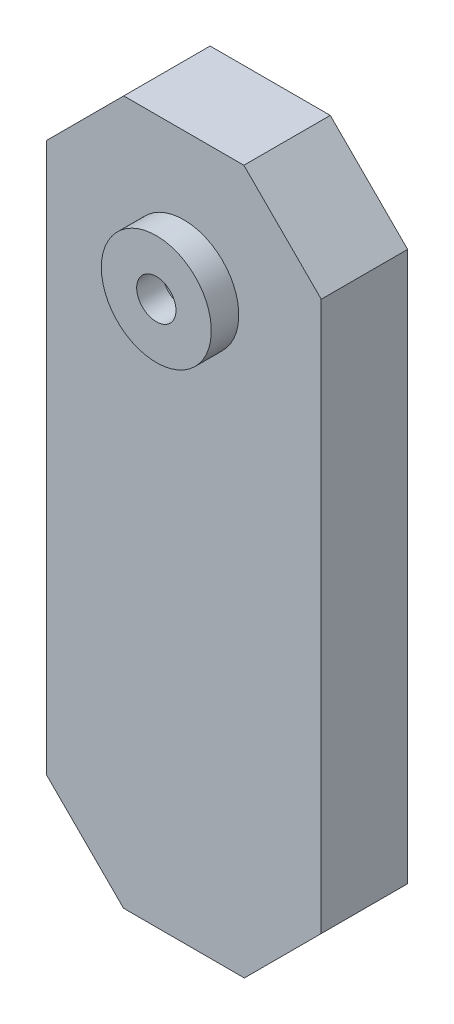
ISO-10303-21;
HEADER;
FILE_DESCRIPTION(('STEP AP214'),'2;1');
FILE_NAME('part.step','',(''),(''),'','','');
FILE_SCHEMA(('AUTOMOTIVE_DESIGN { 1 0 10303 214 1 1 1 1 }'));
ENDSEC;
DATA;
#1=APPLICATION_CONTEXT('core data for automotive mechanical design processes');
#2=APPLICATION_PROTOCOL_DEFINITION('international standard','automotive_design',2000,#1);
#3=PRODUCT_CONTEXT('',#1,'mechanical');
#4=PRODUCT('Part','Part','',(#3));
#5=PRODUCT_RELATED_PRODUCT_CATEGORY('part','',(#4));
#6=PRODUCT_DEFINITION_FORMATION('','',#4);
#7=PRODUCT_DEFINITION_CONTEXT('part definition',#1,'design');
#8=PRODUCT_DEFINITION('design','',#6,#7);
#9=PRODUCT_DEFINITION_SHAPE('','',#8);
#10=(LENGTH_UNIT() NAMED_UNIT(*) SI_UNIT(.MILLI.,.METRE.));
#11=(NAMED_UNIT(*) PLANE_ANGLE_UNIT() SI_UNIT($,.RADIAN.));
#12=(NAMED_UNIT(*) SI_UNIT($,.STERADIAN.) SOLID_ANGLE_UNIT());
#13=UNCERTAINTY_MEASURE_WITH_UNIT(LENGTH_MEASURE(1.E-05),#10,'distance_accuracy_value','');
#14=(GEOMETRIC_REPRESENTATION_CONTEXT(3) GLOBAL_UNCERTAINTY_ASSIGNED_CONTEXT((#13)) GLOBAL_UNIT_ASSIGNED_CONTEXT((#10,
#11,#12)) REPRESENTATION_CONTEXT('',''));
#15=CARTESIAN_POINT('',(0.,0.,0.));
#16=DIRECTION('',(0.,0.,1.));
#17=DIRECTION('',(1.,0.,0.));
#18=AXIS2_PLACEMENT_3D('',#15,#16,#17);
#19=CARTESIAN_POINT('',(-108.417078441272,540.825947063664,0.));
#20=DIRECTION('',(0.,-1.,0.));
#21=DIRECTION('',(1.,0.,0.));
#22=AXIS2_PLACEMENT_3D('',#19,#20,#21);
#23=CYLINDRICAL_SURFACE('',#22,3.50000000000001);
#24=CARTESIAN_POINT('',(-108.417078441272,540.825947063664,0.));
#25=DIRECTION('',(0.,1.,0.));
#26=DIRECTION('',(-1.,0.,0.));
#27=AXIS2_PLACEMENT_3D('',#24,#25,#26);
#28=CIRCLE('',#27,3.50000000000001);
#29=CARTESIAN_POINT('',(-111.917078441272,540.825947063664,0.));
#30=VERTEX_POINT('',#29);
#31=EDGE_CURVE('E11',#30,#30,#28,.T.);
#32=ORIENTED_EDGE('',*,*,#31,.F.);
#33=EDGE_LOOP('',(#32));
#34=FACE_BOUND('',#33,.T.);
#35=CARTESIAN_POINT('',(-108.417078441272,490.825947063664,0.));
#36=DIRECTION('',(0.,1.,0.));
#37=DIRECTION('',(-1.,0.,0.));
#38=AXIS2_PLACEMENT_3D('',#35,#36,#37);
#39=CIRCLE('',#38,3.50000000000001);
#40=CARTESIAN_POINT('',(-111.917078441272,490.825947063664,0.));
#41=VERTEX_POINT('',#40);
#42=EDGE_CURVE('E43',#41,#41,#39,.T.);
#43=ORIENTED_EDGE('',*,*,#42,.T.);
#44=EDGE_LOOP('',(#43));
#45=FACE_BOUND('',#44,.T.);
#46=ADVANCED_FACE('F40',(#34,#45),#23,.T.);
#47=CARTESIAN_POINT('',(-108.417078441272,540.825947063664,0.));
#48=DIRECTION('',(0.,1.,0.));
#49=DIRECTION('',(-1.,0.,0.));
#50=AXIS2_PLACEMENT_3D('',#47,#48,#49);
#51=PLANE('',#50);
#52=ORIENTED_EDGE('',*,*,#31,.T.);
#53=EDGE_LOOP('',(#52));
#54=FACE_BOUND('',#53,.T.);
#55=ADVANCED_FACE('F55',(#54),#51,.T.);
#56=CARTESIAN_POINT('',(-108.417078441272,490.825947063664,0.));
#57=DIRECTION('',(0.,1.,0.));
#58=DIRECTION('',(-1.,0.,0.));
#59=AXIS2_PLACEMENT_3D('',#56,#57,#58);
#60=PLANE('',#59);
#61=ORIENTED_EDGE('',*,*,#42,.F.);
#62=EDGE_LOOP('',(#61));
#63=FACE_BOUND('',#62,.T.);
#64=ADVANCED_FACE('F53',(#63),#60,.F.);
#65=CLOSED_SHELL('',(#46,#55,#64));
#66=MANIFOLD_SOLID_BREP('B2',#65);
#67=CARTESIAN_POINT('',(105.082921558728,640.825947063665,66.));
#68=DIRECTION('',(0.,0.,1.));
#69=DIRECTION('',(1.,0.,0.));
#70=AXIS2_PLACEMENT_3D('',#67,#68,#69);
#71=PLANE('',#70);
#72=DIRECTION('',(0.,1.,0.));
#73=VECTOR('',#72,1.);
#74=CARTESIAN_POINT('',(105.082921558728,162.025080800368,66.));
#75=LINE('',#74,#73);
#76=CARTESIAN_POINT('',(105.082921558728,162.025080800368,66.));
#77=VERTEX_POINT('',#76);
#78=CARTESIAN_POINT('',(105.082921558728,581.722068253563,66.));
#79=VERTEX_POINT('',#78);
#80=EDGE_CURVE('E193',#77,#79,#75,.T.);
#81=ORIENTED_EDGE('',*,*,#80,.T.);
#82=DIRECTION('',(-0.707106781186547,0.707106781186548,0.));
#83=VECTOR('',#82,1.);
#84=CARTESIAN_POINT('',(105.082921558728,581.722068253563,66.));
#85=LINE('',#84,#83);
#86=CARTESIAN_POINT('',(45.9790427486258,640.825947063665,66.));
#87=VERTEX_POINT('',#86);
#88=EDGE_CURVE('E141',#79,#87,#85,.T.);
#89=ORIENTED_EDGE('',*,*,#88,.T.);
#90=DIRECTION('',(-1.,0.,0.));
#91=VECTOR('',#90,1.);
#92=CARTESIAN_POINT('',(45.9790427486258,640.825947063665,66.));
#93=LINE('',#92,#91);
#94=CARTESIAN_POINT('',(-45.8131996311706,640.825947063664,66.));
#95=VERTEX_POINT('',#94);
#96=EDGE_CURVE('E208',#87,#95,#93,.T.);
#97=ORIENTED_EDGE('',*,*,#96,.T.);
#98=DIRECTION('',(-0.707106781186547,-0.707106781186548,0.));
#99=VECTOR('',#98,1.);
#100=CARTESIAN_POINT('',(-45.8131996311706,640.825947063664,66.));
#101=LINE('',#100,#99);
#102=CARTESIAN_POINT('',(-104.917078441272,581.722068253563,66.));
#103=VERTEX_POINT('',#102);
#104=EDGE_CURVE('E220',#95,#103,#101,.T.);
#105=ORIENTED_EDGE('',*,*,#104,.T.);
#106=DIRECTION('',(0.,-1.,0.));
#107=VECTOR('',#106,1.);
#108=CARTESIAN_POINT('',(-104.917078441272,581.722068253563,66.));
#109=LINE('',#108,#107);
#110=CARTESIAN_POINT('',(-104.917078441272,162.212880509357,66.));
#111=VERTEX_POINT('',#110);
#112=EDGE_CURVE('E160',#103,#111,#109,.T.);
#113=ORIENTED_EDGE('',*,*,#112,.T.);
#114=DIRECTION('',(0.707106781186547,-0.707106781186547,0.));
#115=VECTOR('',#114,1.);
#116=CARTESIAN_POINT('',(-104.917078441272,162.212880509357,66.));
#117=LINE('',#116,#115);
#118=CARTESIAN_POINT('',(-45.973174510304,103.268976578389,66.));
#119=VERTEX_POINT('',#118);
#120=EDGE_CURVE('E154',#111,#119,#117,.T.);
#121=ORIENTED_EDGE('',*,*,#120,.T.);
#122=DIRECTION('',(1.,0.,0.));
#123=VECTOR('',#122,1.);
#124=CARTESIAN_POINT('',(-45.973174510304,103.268976578389,66.));
#125=LINE('',#124,#123);
#126=CARTESIAN_POINT('',(46.326817336749,103.268976578389,66.));
#127=VERTEX_POINT('',#126);
#128=EDGE_CURVE('E158',#119,#127,#125,.T.);
#129=ORIENTED_EDGE('',*,*,#128,.T.);
#130=DIRECTION('',(0.707106781186547,0.707106781186548,0.));
#131=VECTOR('',#130,1.);
#132=CARTESIAN_POINT('',(46.326817336749,103.268976578389,66.));
#133=LINE('',#132,#131);
#134=EDGE_CURVE('E98',#127,#77,#133,.T.);
#135=ORIENTED_EDGE('',*,*,#134,.T.);
#136=EDGE_LOOP('',(#81,#89,#97,#105,#113,#121,#129,#135));
#137=FACE_BOUND('',#136,.T.);
#138=CARTESIAN_POINT('',(0.0829215587276402,539.825947063665,66.));
#139=DIRECTION('',(0.,0.,1.));
#140=DIRECTION('',(1.,0.,0.));
#141=AXIS2_PLACEMENT_3D('',#138,#139,#140);
#142=CIRCLE('',#141,42.);
#143=CARTESIAN_POINT('',(-41.9170784412724,539.825947063665,66.));
#144=VERTEX_POINT('',#143);
#145=EDGE_CURVE('E226',#144,#144,#142,.T.);
#146=ORIENTED_EDGE('',*,*,#145,.F.);
#147=EDGE_LOOP('',(#146));
#148=FACE_BOUND('',#147,.T.);
#149=ADVANCED_FACE('F81',(#137,#148),#71,.T.);
#150=CARTESIAN_POINT('',(105.082921558728,162.025080800368,66.));
#151=DIRECTION('',(-1.,0.,0.));
#152=DIRECTION('',(0.,-1.,0.));
#153=AXIS2_PLACEMENT_3D('',#150,#151,#152);
#154=PLANE('',#153);
#155=DIRECTION('',(0.,1.,0.));
#156=VECTOR('',#155,1.);
#157=CARTESIAN_POINT('',(105.082921558728,162.025080800368,0.));
#158=LINE('',#157,#156);
#159=CARTESIAN_POINT('',(105.082921558728,162.025080800368,0.));
#160=VERTEX_POINT('',#159);
#161=CARTESIAN_POINT('',(105.082921558728,581.722068253563,0.));
#162=VERTEX_POINT('',#161);
#163=EDGE_CURVE('E178',#160,#162,#158,.T.);
#164=ORIENTED_EDGE('',*,*,#163,.T.);
#165=DIRECTION('',(0.,0.,-1.));
#166=VECTOR('',#165,1.);
#167=CARTESIAN_POINT('',(105.082921558728,581.722068253563,66.));
#168=LINE('',#167,#166);
#169=EDGE_CURVE('E38',#79,#162,#168,.T.);
#170=ORIENTED_EDGE('',*,*,#169,.F.);
#171=ORIENTED_EDGE('',*,*,#80,.F.);
#172=DIRECTION('',(0.,0.,-1.));
#173=VECTOR('',#172,1.);
#174=CARTESIAN_POINT('',(105.082921558728,162.025080800368,66.));
#175=LINE('',#174,#173);
#176=EDGE_CURVE('E174',#77,#160,#175,.T.);
#177=ORIENTED_EDGE('',*,*,#176,.T.);
#178=EDGE_LOOP('',(#164,#170,#171,#177));
#179=FACE_BOUND('',#178,.T.);
#180=ADVANCED_FACE('F83',(#179),#154,.F.);
#181=CARTESIAN_POINT('',(105.082921558728,581.722068253563,66.));
#182=DIRECTION('',(-0.707106781186548,-0.707106781186547,0.));
#183=DIRECTION('',(0.707106781186547,-0.707106781186548,0.));
#184=AXIS2_PLACEMENT_3D('',#181,#182,#183);
#185=PLANE('',#184);
#186=DIRECTION('',(-0.707106781186547,0.707106781186548,0.));
#187=VECTOR('',#186,1.);
#188=CARTESIAN_POINT('',(105.082921558728,581.722068253563,0.));
#189=LINE('',#188,#187);
#190=CARTESIAN_POINT('',(45.9790427486258,640.825947063665,0.));
#191=VERTEX_POINT('',#190);
#192=EDGE_CURVE('E181',#162,#191,#189,.T.);
#193=ORIENTED_EDGE('',*,*,#192,.T.);
#194=DIRECTION('',(0.,0.,-1.));
#195=VECTOR('',#194,1.);
#196=CARTESIAN_POINT('',(45.9790427486258,640.825947063665,66.));
#197=LINE('',#196,#195);
#198=EDGE_CURVE('E90',#87,#191,#197,.T.);
#199=ORIENTED_EDGE('',*,*,#198,.F.);
#200=ORIENTED_EDGE('',*,*,#88,.F.);
#201=ORIENTED_EDGE('',*,*,#169,.T.);
#202=EDGE_LOOP('',(#193,#199,#200,#201));
#203=FACE_BOUND('',#202,.T.);
#204=ADVANCED_FACE('F264',(#203),#185,.F.);
#205=CARTESIAN_POINT('',(45.9790427486258,640.825947063665,66.));
#206=DIRECTION('',(0.,-1.,0.));
#207=DIRECTION('',(1.,0.,0.));
#208=AXIS2_PLACEMENT_3D('',#205,#206,#207);
#209=PLANE('',#208);
#210=DIRECTION('',(-1.,0.,0.));
#211=VECTOR('',#210,1.);
#212=CARTESIAN_POINT('',(45.9790427486258,640.825947063665,0.));
#213=LINE('',#212,#211);
#214=CARTESIAN_POINT('',(-45.8131996311706,640.825947063664,0.));
#215=VERTEX_POINT('',#214);
#216=EDGE_CURVE('E184',#191,#215,#213,.T.);
#217=ORIENTED_EDGE('',*,*,#216,.T.);
#218=DIRECTION('',(0.,0.,-1.));
#219=VECTOR('',#218,1.);
#220=CARTESIAN_POINT('',(-45.8131996311706,640.825947063664,66.));
#221=LINE('',#220,#219);
#222=EDGE_CURVE('E200',#95,#215,#221,.T.);
#223=ORIENTED_EDGE('',*,*,#222,.F.);
#224=ORIENTED_EDGE('',*,*,#96,.F.);
#225=ORIENTED_EDGE('',*,*,#198,.T.);
#226=EDGE_LOOP('',(#217,#223,#224,#225));
#227=FACE_BOUND('',#226,.T.);
#228=ADVANCED_FACE('F206',(#227),#209,.F.);
#229=CARTESIAN_POINT('',(-45.8131996311706,640.825947063664,66.));
#230=DIRECTION('',(0.707106781186548,-0.707106781186547,0.));
#231=DIRECTION('',(0.707106781186547,0.707106781186548,0.));
#232=AXIS2_PLACEMENT_3D('',#229,#230,#231);
#233=PLANE('',#232);
#234=DIRECTION('',(-0.707106781186547,-0.707106781186548,0.));
#235=VECTOR('',#234,1.);
#236=CARTESIAN_POINT('',(-45.8131996311706,640.825947063664,0.));
#237=LINE('',#236,#235);
#238=CARTESIAN_POINT('',(-104.917078441272,581.722068253563,0.));
#239=VERTEX_POINT('',#238);
#240=EDGE_CURVE('E186',#215,#239,#237,.T.);
#241=ORIENTED_EDGE('',*,*,#240,.T.);
#242=DIRECTION('',(0.,0.,-1.));
#243=VECTOR('',#242,1.);
#244=CARTESIAN_POINT('',(-104.917078441272,581.722068253563,66.));
#245=LINE('',#244,#243);
#246=EDGE_CURVE('E197',#103,#239,#245,.T.);
#247=ORIENTED_EDGE('',*,*,#246,.F.);
#248=ORIENTED_EDGE('',*,*,#104,.F.);
#249=ORIENTED_EDGE('',*,*,#222,.T.);
#250=EDGE_LOOP('',(#241,#247,#248,#249));
#251=FACE_BOUND('',#250,.T.);
#252=ADVANCED_FACE('F216',(#251),#233,.F.);
#253=CARTESIAN_POINT('',(-104.917078441272,581.722068253563,66.));
#254=DIRECTION('',(1.,0.,0.));
#255=DIRECTION('',(0.,1.,0.));
#256=AXIS2_PLACEMENT_3D('',#253,#254,#255);
#257=PLANE('',#256);
#258=DIRECTION('',(0.,-1.,0.));
#259=VECTOR('',#258,1.);
#260=CARTESIAN_POINT('',(-104.917078441272,581.722068253563,0.));
#261=LINE('',#260,#259);
#262=CARTESIAN_POINT('',(-104.917078441272,162.212880509357,0.));
#263=VERTEX_POINT('',#262);
#264=EDGE_CURVE('E188',#239,#263,#261,.T.);
#265=ORIENTED_EDGE('',*,*,#264,.T.);
#266=DIRECTION('',(0.,0.,-1.));
#267=VECTOR('',#266,1.);
#268=CARTESIAN_POINT('',(-104.917078441272,162.212880509357,66.));
#269=LINE('',#268,#267);
#270=EDGE_CURVE('E169',#111,#263,#269,.T.);
#271=ORIENTED_EDGE('',*,*,#270,.F.);
#272=ORIENTED_EDGE('',*,*,#112,.F.);
#273=ORIENTED_EDGE('',*,*,#246,.T.);
#274=EDGE_LOOP('',(#265,#271,#272,#273));
#275=FACE_BOUND('',#274,.T.);
#276=ADVANCED_FACE('F219',(#275),#257,.F.);
#277=CARTESIAN_POINT('',(-104.917078441272,162.212880509357,66.));
#278=DIRECTION('',(0.707106781186547,0.707106781186547,0.));
#279=DIRECTION('',(-0.707106781186548,0.707106781186548,0.));
#280=AXIS2_PLACEMENT_3D('',#277,#278,#279);
#281=PLANE('',#280);
#282=DIRECTION('',(0.707106781186547,-0.707106781186547,0.));
#283=VECTOR('',#282,1.);
#284=CARTESIAN_POINT('',(-104.917078441272,162.212880509357,0.));
#285=LINE('',#284,#283);
#286=CARTESIAN_POINT('',(-45.973174510304,103.268976578389,0.));
#287=VERTEX_POINT('',#286);
#288=EDGE_CURVE('E168',#263,#287,#285,.T.);
#289=ORIENTED_EDGE('',*,*,#288,.T.);
#290=DIRECTION('',(0.,0.,-1.));
#291=VECTOR('',#290,1.);
#292=CARTESIAN_POINT('',(-45.973174510304,103.268976578389,66.));
#293=LINE('',#292,#291);
#294=EDGE_CURVE('E165',#119,#287,#293,.T.);
#295=ORIENTED_EDGE('',*,*,#294,.F.);
#296=ORIENTED_EDGE('',*,*,#120,.F.);
#297=ORIENTED_EDGE('',*,*,#270,.T.);
#298=EDGE_LOOP('',(#289,#295,#296,#297));
#299=FACE_BOUND('',#298,.T.);
#300=ADVANCED_FACE('F166',(#299),#281,.F.);
#301=CARTESIAN_POINT('',(-45.973174510304,103.268976578389,66.));
#302=DIRECTION('',(0.,1.,0.));
#303=DIRECTION('',(0.,0.,1.));
#304=AXIS2_PLACEMENT_3D('',#301,#302,#303);
#305=PLANE('',#304);
#306=DIRECTION('',(1.,0.,0.));
#307=VECTOR('',#306,1.);
#308=CARTESIAN_POINT('',(-45.973174510304,103.268976578389,0.));
#309=LINE('',#308,#307);
#310=CARTESIAN_POINT('',(46.326817336749,103.268976578389,0.));
#311=VERTEX_POINT('',#310);
#312=EDGE_CURVE('E127',#287,#311,#309,.T.);
#313=ORIENTED_EDGE('',*,*,#312,.T.);
#314=DIRECTION('',(0.,0.,-1.));
#315=VECTOR('',#314,1.);
#316=CARTESIAN_POINT('',(46.326817336749,103.268976578389,66.));
#317=LINE('',#316,#315);
#318=EDGE_CURVE('E170',#127,#311,#317,.T.);
#319=ORIENTED_EDGE('',*,*,#318,.F.);
#320=ORIENTED_EDGE('',*,*,#128,.F.);
#321=ORIENTED_EDGE('',*,*,#294,.T.);
#322=EDGE_LOOP('',(#313,#319,#320,#321));
#323=FACE_BOUND('',#322,.T.);
#324=ADVANCED_FACE('F172',(#323),#305,.F.);
#325=CARTESIAN_POINT('',(46.326817336749,103.268976578389,66.));
#326=DIRECTION('',(-0.707106781186548,0.707106781186547,0.));
#327=DIRECTION('',(-0.707106781186547,-0.707106781186548,0.));
#328=AXIS2_PLACEMENT_3D('',#325,#326,#327);
#329=PLANE('',#328);
#330=DIRECTION('',(0.707106781186547,0.707106781186548,0.));
#331=VECTOR('',#330,1.);
#332=CARTESIAN_POINT('',(46.326817336749,103.268976578389,0.));
#333=LINE('',#332,#331);
#334=EDGE_CURVE('E133',#311,#160,#333,.T.);
#335=ORIENTED_EDGE('',*,*,#334,.T.);
#336=ORIENTED_EDGE('',*,*,#176,.F.);
#337=ORIENTED_EDGE('',*,*,#134,.F.);
#338=ORIENTED_EDGE('',*,*,#318,.T.);
#339=EDGE_LOOP('',(#335,#336,#337,#338));
#340=FACE_BOUND('',#339,.T.);
#341=ADVANCED_FACE('F269',(#340),#329,.F.);
#342=CARTESIAN_POINT('',(105.082921558728,640.825947063665,0.));
#343=DIRECTION('',(0.,0.,1.));
#344=DIRECTION('',(1.,0.,0.));
#345=AXIS2_PLACEMENT_3D('',#342,#343,#344);
#346=PLANE('',#345);
#347=ORIENTED_EDGE('',*,*,#163,.F.);
#348=ORIENTED_EDGE('',*,*,#334,.F.);
#349=ORIENTED_EDGE('',*,*,#312,.F.);
#350=ORIENTED_EDGE('',*,*,#288,.F.);
#351=ORIENTED_EDGE('',*,*,#264,.F.);
#352=ORIENTED_EDGE('',*,*,#240,.F.);
#353=ORIENTED_EDGE('',*,*,#216,.F.);
#354=ORIENTED_EDGE('',*,*,#192,.F.);
#355=EDGE_LOOP('',(#347,#348,#349,#350,#351,#352,#353,#354));
#356=FACE_BOUND('',#355,.T.);
#357=ADVANCED_FACE('F212',(#356),#346,.F.);
#358=CARTESIAN_POINT('',(0.0829215587276402,539.825947063665,87.));
#359=DIRECTION('',(0.,0.,-1.));
#360=DIRECTION('',(-1.,0.,0.));
#361=AXIS2_PLACEMENT_3D('',#358,#359,#360);
#362=CYLINDRICAL_SURFACE('',#361,42.);
#363=CARTESIAN_POINT('',(0.0829215587276402,539.825947063665,87.));
#364=DIRECTION('',(0.,0.,1.));
#365=DIRECTION('',(1.,0.,0.));
#366=AXIS2_PLACEMENT_3D('',#363,#364,#365);
#367=CIRCLE('',#366,42.);
#368=CARTESIAN_POINT('',(-41.9170784412724,539.825947063665,87.));
#369=VERTEX_POINT('',#368);
#370=EDGE_CURVE('E182',#369,#369,#367,.T.);
#371=CARTESIAN_POINT('',(-41.9170784412724,539.825947063665,87.));
#372=CARTESIAN_POINT('',(-41.9170784412724,539.825947063665,86.78125));
#373=CARTESIAN_POINT('',(-41.9170784412724,539.825947063665,86.5625));
#374=CARTESIAN_POINT('',(-41.9170784412724,539.825947063665,86.125));
#375=CARTESIAN_POINT('',(-41.9170784412724,539.825947063665,85.90625));
#376=CARTESIAN_POINT('',(-41.9170784412724,539.825947063665,85.46875));
#377=CARTESIAN_POINT('',(-41.9170784412724,539.825947063665,85.25));
#378=CARTESIAN_POINT('',(-41.9170784412724,539.825947063665,84.8125));
#379=CARTESIAN_POINT('',(-41.9170784412724,539.825947063665,84.59375));
#380=CARTESIAN_POINT('',(-41.9170784412724,539.825947063665,84.15625));
#381=CARTESIAN_POINT('',(-41.9170784412724,539.825947063665,83.9375));
#382=CARTESIAN_POINT('',(-41.9170784412724,539.825947063665,83.5));
#383=CARTESIAN_POINT('',(-41.9170784412724,539.825947063665,83.28125));
#384=CARTESIAN_POINT('',(-41.9170784412724,539.825947063665,82.84375));
#385=CARTESIAN_POINT('',(-41.9170784412724,539.825947063665,82.625));
#386=CARTESIAN_POINT('',(-41.9170784412724,539.825947063665,82.1875));
#387=CARTESIAN_POINT('',(-41.9170784412724,539.825947063665,81.96875));
#388=CARTESIAN_POINT('',(-41.9170784412724,539.825947063665,81.53125));
#389=CARTESIAN_POINT('',(-41.9170784412724,539.825947063665,81.3125));
#390=CARTESIAN_POINT('',(-41.9170784412724,539.825947063665,80.875));
#391=CARTESIAN_POINT('',(-41.9170784412724,539.825947063665,80.65625));
#392=CARTESIAN_POINT('',(-41.9170784412724,539.825947063665,80.21875));
#393=CARTESIAN_POINT('',(-41.9170784412724,539.825947063665,80.));
#394=CARTESIAN_POINT('',(-41.9170784412724,539.825947063665,79.5625));
#395=CARTESIAN_POINT('',(-41.9170784412724,539.825947063665,79.34375));
#396=CARTESIAN_POINT('',(-41.9170784412724,539.825947063665,78.90625));
#397=CARTESIAN_POINT('',(-41.9170784412724,539.825947063665,78.6875));
#398=CARTESIAN_POINT('',(-41.9170784412724,539.825947063665,78.25));
#399=CARTESIAN_POINT('',(-41.9170784412724,539.825947063665,78.03125));
#400=CARTESIAN_POINT('',(-41.9170784412724,539.825947063665,77.59375));
#401=CARTESIAN_POINT('',(-41.9170784412724,539.825947063665,77.375));
#402=CARTESIAN_POINT('',(-41.9170784412724,539.825947063665,76.9375));
#403=CARTESIAN_POINT('',(-41.9170784412724,539.825947063665,76.71875));
#404=CARTESIAN_POINT('',(-41.9170784412724,539.825947063665,76.28125));
#405=CARTESIAN_POINT('',(-41.9170784412724,539.825947063665,76.0625));
#406=CARTESIAN_POINT('',(-41.9170784412724,539.825947063665,75.625));
#407=CARTESIAN_POINT('',(-41.9170784412724,539.825947063665,75.40625));
#408=CARTESIAN_POINT('',(-41.9170784412724,539.825947063665,74.96875));
#409=CARTESIAN_POINT('',(-41.9170784412724,539.825947063665,74.75));
#410=CARTESIAN_POINT('',(-41.9170784412724,539.825947063665,74.3125));
#411=CARTESIAN_POINT('',(-41.9170784412724,539.825947063665,74.09375));
#412=CARTESIAN_POINT('',(-41.9170784412724,539.825947063665,73.65625));
#413=CARTESIAN_POINT('',(-41.9170784412724,539.825947063665,73.4375));
#414=CARTESIAN_POINT('',(-41.9170784412724,539.825947063665,73.));
#415=CARTESIAN_POINT('',(-41.9170784412724,539.825947063665,72.78125));
#416=CARTESIAN_POINT('',(-41.9170784412724,539.825947063665,72.34375));
#417=CARTESIAN_POINT('',(-41.9170784412724,539.825947063665,72.125));
#418=CARTESIAN_POINT('',(-41.9170784412724,539.825947063665,71.6875));
#419=CARTESIAN_POINT('',(-41.9170784412724,539.825947063665,71.46875));
#420=CARTESIAN_POINT('',(-41.9170784412724,539.825947063665,71.03125));
#421=CARTESIAN_POINT('',(-41.9170784412724,539.825947063665,70.8125));
#422=CARTESIAN_POINT('',(-41.9170784412724,539.825947063665,70.375));
#423=CARTESIAN_POINT('',(-41.9170784412724,539.825947063665,70.15625));
#424=CARTESIAN_POINT('',(-41.9170784412724,539.825947063665,69.71875));
#425=CARTESIAN_POINT('',(-41.9170784412724,539.825947063665,69.5));
#426=CARTESIAN_POINT('',(-41.9170784412724,539.825947063665,69.0625));
#427=CARTESIAN_POINT('',(-41.9170784412724,539.825947063665,68.84375));
#428=CARTESIAN_POINT('',(-41.9170784412724,539.825947063665,68.40625));
#429=CARTESIAN_POINT('',(-41.9170784412724,539.825947063665,68.1875));
#430=CARTESIAN_POINT('',(-41.9170784412724,539.825947063665,67.75));
#431=CARTESIAN_POINT('',(-41.9170784412724,539.825947063665,67.53125));
#432=CARTESIAN_POINT('',(-41.9170784412724,539.825947063665,67.09375));
#433=CARTESIAN_POINT('',(-41.9170784412724,539.825947063665,66.875));
#434=CARTESIAN_POINT('',(-41.9170784412724,539.825947063665,66.4375));
#435=CARTESIAN_POINT('',(-41.9170784412724,539.825947063665,66.21875));
#436=CARTESIAN_POINT('',(-41.9170784412724,539.825947063665,66.));
#437=B_SPLINE_CURVE_WITH_KNOTS('',3,(#371,#372,#373,#374,#375,#376,#377,#378,#379,#380,#381,
#382,#383,#384,#385,#386,#387,#388,#389,#390,#391,#392,#393,#394,#395,#396,#397,#398,#399,#400,
#401,#402,#403,#404,#405,#406,#407,#408,#409,#410,#411,#412,#413,#414,#415,#416,#417,#418,#419,
#420,#421,#422,#423,#424,#425,#426,#427,#428,#429,#430,#431,#432,#433,#434,#435,#436),
.UNSPECIFIED.,.F.,.F.,(4,2,2,2,2,2,2,2,2,2,2,2,2,2,2,2,2,2,2,2,2,2,2,2,2,2,2,2,2,2,2,2,4),(0.,
0.656249999999997,1.31249999999999,1.96874999999999,2.62499999999999,3.28125,3.9375,
4.59374999999999,5.24999999999999,5.90625,6.5625,7.21875,7.87499999999999,8.53124999999999,
9.1875,9.84375,10.5,11.15625,11.8125,12.46875,13.125,13.78125,14.4375,15.09375,15.75,16.40625,
17.0625,17.71875,18.375,19.03125,19.6875,20.34375,21.),.UNSPECIFIED.);
#438=EDGE_CURVE('BSEAM249',#369,#144,#437,.T.);
#439=ORIENTED_EDGE('',*,*,#370,.F.);
#440=ORIENTED_EDGE('',*,*,#145,.T.);
#441=ORIENTED_EDGE('',*,*,#438,.T.);
#442=ORIENTED_EDGE('',*,*,#438,.F.);
#443=EDGE_LOOP('',(#439,#441,#440,#442));
#444=FACE_BOUND('',#443,.T.);
#445=ADVANCED_FACE('F249',(#444),#362,.T.);
#446=CARTESIAN_POINT('',(0.0829215587276402,539.825947063665,87.));
#447=DIRECTION('',(0.,0.,1.));
#448=DIRECTION('',(1.,0.,0.));
#449=AXIS2_PLACEMENT_3D('',#446,#447,#448);
#450=PLANE('',#449);
#451=CARTESIAN_POINT('',(0.0829215587276402,539.825947063665,87.));
#452=DIRECTION('',(0.,0.,1.));
#453=DIRECTION('',(1.,0.,0.));
#454=AXIS2_PLACEMENT_3D('',#451,#452,#453);
#455=CIRCLE('',#454,15.);
#456=CARTESIAN_POINT('',(15.0829215587276,539.825947063665,87.));
#457=VERTEX_POINT('',#456);
#458=EDGE_CURVE('E232',#457,#457,#455,.T.);
#459=ORIENTED_EDGE('',*,*,#458,.F.);
#460=EDGE_LOOP('',(#459));
#461=FACE_BOUND('',#460,.T.);
#462=ORIENTED_EDGE('',*,*,#370,.T.);
#463=EDGE_LOOP('',(#462));
#464=FACE_BOUND('',#463,.T.);
#465=ADVANCED_FACE('F243',(#461,#464),#450,.T.);
#466=CARTESIAN_POINT('',(0.0829215587276402,539.825947063665,67.));
#467=DIRECTION('',(0.,0.,1.));
#468=DIRECTION('',(1.,0.,0.));
#469=AXIS2_PLACEMENT_3D('',#466,#467,#468);
#470=CYLINDRICAL_SURFACE('',#469,15.);
#471=CARTESIAN_POINT('',(0.0829215587276402,539.825947063665,67.));
#472=DIRECTION('',(0.,0.,1.));
#473=DIRECTION('',(1.,0.,0.));
#474=AXIS2_PLACEMENT_3D('',#471,#472,#473);
#475=CIRCLE('',#474,15.);
#476=CARTESIAN_POINT('',(15.0829215587276,539.825947063665,67.));
#477=VERTEX_POINT('',#476);
#478=EDGE_CURVE('E229',#477,#477,#475,.T.);
#479=ORIENTED_EDGE('',*,*,#478,.F.);
#480=EDGE_LOOP('',(#479));
#481=FACE_BOUND('',#480,.T.);
#482=ORIENTED_EDGE('',*,*,#458,.T.);
#483=EDGE_LOOP('',(#482));
#484=FACE_BOUND('',#483,.T.);
#485=ADVANCED_FACE('F240',(#481,#484),#470,.F.);
#486=CARTESIAN_POINT('',(0.0829215587276402,539.825947063665,67.));
#487=DIRECTION('',(0.,0.,1.));
#488=DIRECTION('',(1.,0.,0.));
#489=AXIS2_PLACEMENT_3D('',#486,#487,#488);
#490=PLANE('',#489);
#491=ORIENTED_EDGE('',*,*,#478,.T.);
#492=EDGE_LOOP('',(#491));
#493=FACE_BOUND('',#492,.T.);
#494=ADVANCED_FACE('F238',(#493),#490,.T.);
#495=CLOSED_SHELL('',(#149,#180,#204,#228,#252,#276,#300,#324,#341,#357,#445,#465,#485,#494));
#496=MANIFOLD_SOLID_BREP('B6',#495);
#497=ADVANCED_BREP_SHAPE_REPRESENTATION('',(#18,#66,#496),#14);
#498=SHAPE_DEFINITION_REPRESENTATION(#9,#497);
ENDSEC;
END-ISO-10303-21;
